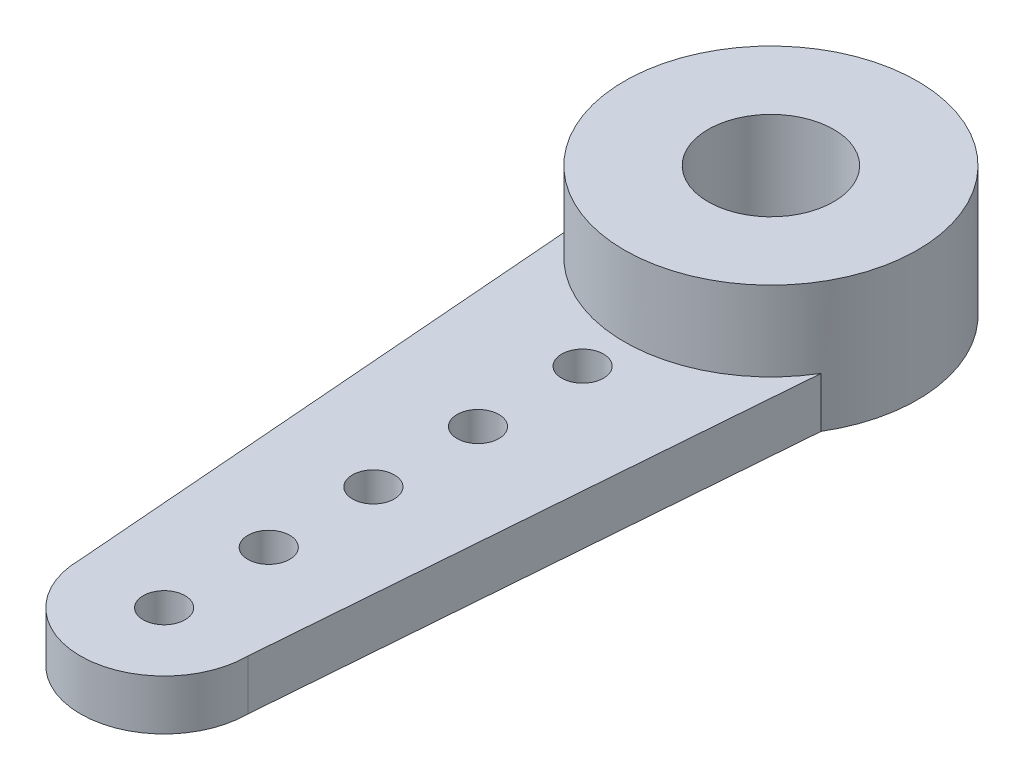
ISO-10303-21;
HEADER;
FILE_DESCRIPTION(('STEP AP214'),'2;1');
FILE_NAME('part.step','',(''),(''),'','','');
FILE_SCHEMA(('AUTOMOTIVE_DESIGN { 1 0 10303 214 1 1 1 1 }'));
ENDSEC;
DATA;
#1=APPLICATION_CONTEXT('core data for automotive mechanical design processes');
#2=APPLICATION_PROTOCOL_DEFINITION('international standard','automotive_design',2000,#1);
#3=PRODUCT_CONTEXT('',#1,'mechanical');
#4=PRODUCT('Part','Part','',(#3));
#5=PRODUCT_RELATED_PRODUCT_CATEGORY('part','',(#4));
#6=PRODUCT_DEFINITION_FORMATION('','',#4);
#7=PRODUCT_DEFINITION_CONTEXT('part definition',#1,'design');
#8=PRODUCT_DEFINITION('design','',#6,#7);
#9=PRODUCT_DEFINITION_SHAPE('','',#8);
#10=(LENGTH_UNIT() NAMED_UNIT(*) SI_UNIT(.MILLI.,.METRE.));
#11=(NAMED_UNIT(*) PLANE_ANGLE_UNIT() SI_UNIT($,.RADIAN.));
#12=(NAMED_UNIT(*) SI_UNIT($,.STERADIAN.) SOLID_ANGLE_UNIT());
#13=UNCERTAINTY_MEASURE_WITH_UNIT(LENGTH_MEASURE(1.E-05),#10,'distance_accuracy_value','');
#14=(GEOMETRIC_REPRESENTATION_CONTEXT(3) GLOBAL_UNCERTAINTY_ASSIGNED_CONTEXT((#13)) GLOBAL_UNIT_ASSIGNED_CONTEXT((#10,
#11,#12)) REPRESENTATION_CONTEXT('',''));
#15=CARTESIAN_POINT('',(0.,0.,0.));
#16=DIRECTION('',(0.,0.,1.));
#17=DIRECTION('',(1.,0.,0.));
#18=AXIS2_PLACEMENT_3D('',#15,#16,#17);
#19=CARTESIAN_POINT('',(0.,3.1,0.));
#20=DIRECTION('',(0.,-1.,0.));
#21=DIRECTION('',(0.,0.,-1.));
#22=AXIS2_PLACEMENT_3D('',#19,#20,#21);
#23=CYLINDRICAL_SURFACE('',#22,3.5);
#24=CARTESIAN_POINT('',(0.,3.1,0.));
#25=DIRECTION('',(0.,1.,0.));
#26=DIRECTION('',(0.,0.,1.));
#27=AXIS2_PLACEMENT_3D('',#24,#25,#26);
#28=CIRCLE('',#27,3.5);
#29=CARTESIAN_POINT('',(0.,3.1,3.5));
#30=VERTEX_POINT('',#29);
#31=EDGE_CURVE('E11',#30,#30,#28,.T.);
#32=ORIENTED_EDGE('',*,*,#31,.F.);
#33=EDGE_LOOP('',(#32));
#34=FACE_BOUND('',#33,.T.);
#35=DIRECTION('',(0.,-1.,0.));
#36=VECTOR('',#35,1.);
#37=CARTESIAN_POINT('',(-3.,1.2,1.80277563773199));
#38=LINE('',#37,#36);
#39=CARTESIAN_POINT('',(-3.,1.2,1.80277563773199));
#40=VERTEX_POINT('',#39);
#41=CARTESIAN_POINT('',(-3.,0.,1.80277563773199));
#42=VERTEX_POINT('',#41);
#43=EDGE_CURVE('E52',#40,#42,#38,.T.);
#44=ORIENTED_EDGE('',*,*,#43,.F.);
#45=CARTESIAN_POINT('',(0.,1.2,0.));
#46=DIRECTION('',(0.,-1.,0.));
#47=DIRECTION('',(0.,0.,1.));
#48=AXIS2_PLACEMENT_3D('',#45,#46,#47);
#49=CIRCLE('',#48,3.5);
#50=CARTESIAN_POINT('',(3.,1.2,1.80277563773199));
#51=VERTEX_POINT('',#50);
#52=EDGE_CURVE('E47',#51,#40,#49,.T.);
#53=ORIENTED_EDGE('',*,*,#52,.F.);
#54=DIRECTION('',(0.,-1.,0.));
#55=VECTOR('',#54,1.);
#56=CARTESIAN_POINT('',(3.,1.2,1.80277563773199));
#57=LINE('',#56,#55);
#58=CARTESIAN_POINT('',(3.,0.,1.80277563773199));
#59=VERTEX_POINT('',#58);
#60=EDGE_CURVE('E93',#51,#59,#57,.T.);
#61=ORIENTED_EDGE('',*,*,#60,.T.);
#62=CARTESIAN_POINT('',(0.,0.,0.));
#63=DIRECTION('',(0.,1.,0.));
#64=DIRECTION('',(0.,0.,1.));
#65=AXIS2_PLACEMENT_3D('',#62,#63,#64);
#66=CIRCLE('',#65,3.5);
#67=EDGE_CURVE('E36',#59,#42,#66,.T.);
#68=ORIENTED_EDGE('',*,*,#67,.T.);
#69=EDGE_LOOP('',(#44,#53,#61,#68));
#70=FACE_BOUND('',#69,.T.);
#71=ADVANCED_FACE('F33',(#34,#70),#23,.T.);
#72=CARTESIAN_POINT('',(0.,3.1,0.));
#73=DIRECTION('',(0.,1.,0.));
#74=DIRECTION('',(0.,0.,1.));
#75=AXIS2_PLACEMENT_3D('',#72,#73,#74);
#76=PLANE('',#75);
#77=CARTESIAN_POINT('',(0.,3.1,0.));
#78=DIRECTION('',(0.,1.,0.));
#79=DIRECTION('',(0.,0.,1.));
#80=AXIS2_PLACEMENT_3D('',#77,#78,#79);
#81=CIRCLE('',#80,1.5);
#82=CARTESIAN_POINT('',(0.,3.1,1.5));
#83=VERTEX_POINT('',#82);
#84=EDGE_CURVE('E274',#83,#83,#81,.T.);
#85=ORIENTED_EDGE('',*,*,#84,.F.);
#86=EDGE_LOOP('',(#85));
#87=FACE_BOUND('',#86,.T.);
#88=ORIENTED_EDGE('',*,*,#31,.T.);
#89=EDGE_LOOP('',(#88));
#90=FACE_BOUND('',#89,.T.);
#91=ADVANCED_FACE('F123',(#87,#90),#76,.T.);
#92=CARTESIAN_POINT('',(0.,0.,0.));
#93=DIRECTION('',(0.,1.,0.));
#94=DIRECTION('',(0.,0.,1.));
#95=AXIS2_PLACEMENT_3D('',#92,#93,#94);
#96=PLANE('',#95);
#97=CARTESIAN_POINT('',(0.,0.,12.));
#98=DIRECTION('',(0.,1.,0.));
#99=DIRECTION('',(0.,0.,1.));
#100=AXIS2_PLACEMENT_3D('',#97,#98,#99);
#101=CIRCLE('',#100,0.5);
#102=CARTESIAN_POINT('',(0.,0.,12.5));
#103=VERTEX_POINT('',#102);
#104=EDGE_CURVE('E246',#103,#103,#101,.F.);
#105=ORIENTED_EDGE('',*,*,#104,.F.);
#106=EDGE_LOOP('',(#105));
#107=FACE_BOUND('',#106,.T.);
#108=CARTESIAN_POINT('',(0.,0.,9.5));
#109=DIRECTION('',(0.,1.,0.));
#110=DIRECTION('',(0.,0.,1.));
#111=AXIS2_PLACEMENT_3D('',#108,#109,#110);
#112=CIRCLE('',#111,0.5);
#113=CARTESIAN_POINT('',(0.,0.,10.));
#114=VERTEX_POINT('',#113);
#115=EDGE_CURVE('E252',#114,#114,#112,.F.);
#116=ORIENTED_EDGE('',*,*,#115,.F.);
#117=EDGE_LOOP('',(#116));
#118=FACE_BOUND('',#117,.T.);
#119=CARTESIAN_POINT('',(0.,0.,7.));
#120=DIRECTION('',(0.,1.,0.));
#121=DIRECTION('',(0.,0.,1.));
#122=AXIS2_PLACEMENT_3D('',#119,#120,#121);
#123=CIRCLE('',#122,0.5);
#124=CARTESIAN_POINT('',(0.,0.,7.5));
#125=VERTEX_POINT('',#124);
#126=EDGE_CURVE('E258',#125,#125,#123,.F.);
#127=ORIENTED_EDGE('',*,*,#126,.F.);
#128=EDGE_LOOP('',(#127));
#129=FACE_BOUND('',#128,.T.);
#130=CARTESIAN_POINT('',(0.,0.,4.5));
#131=DIRECTION('',(0.,1.,0.));
#132=DIRECTION('',(0.,0.,1.));
#133=AXIS2_PLACEMENT_3D('',#130,#131,#132);
#134=CIRCLE('',#133,0.5);
#135=CARTESIAN_POINT('',(0.,0.,5.));
#136=VERTEX_POINT('',#135);
#137=EDGE_CURVE('E264',#136,#136,#134,.F.);
#138=ORIENTED_EDGE('',*,*,#137,.F.);
#139=EDGE_LOOP('',(#138));
#140=FACE_BOUND('',#139,.T.);
#141=CARTESIAN_POINT('',(0.,0.,14.5));
#142=DIRECTION('',(0.,1.,0.));
#143=DIRECTION('',(0.,0.,1.));
#144=AXIS2_PLACEMENT_3D('',#141,#142,#143);
#145=CIRCLE('',#144,0.5);
#146=CARTESIAN_POINT('',(0.,0.,15.));
#147=VERTEX_POINT('',#146);
#148=EDGE_CURVE('E250',#147,#147,#145,.F.);
#149=ORIENTED_EDGE('',*,*,#148,.F.);
#150=EDGE_LOOP('',(#149));
#151=FACE_BOUND('',#150,.T.);
#152=ORIENTED_EDGE('',*,*,#67,.F.);
#153=DIRECTION('',(0.0785142455836985,0.,-0.99691299181043));
#154=VECTOR('',#153,1.);
#155=CARTESIAN_POINT('',(3.,0.,1.80277563773199));
#156=LINE('',#155,#154);
#157=CARTESIAN_POINT('',(2.,0.,14.5));
#158=VERTEX_POINT('',#157);
#159=EDGE_CURVE('E101',#158,#59,#156,.T.);
#160=ORIENTED_EDGE('',*,*,#159,.F.);
#161=CARTESIAN_POINT('',(0.,0.,14.5));
#162=DIRECTION('',(0.,1.,0.));
#163=DIRECTION('',(0.,0.,-1.));
#164=AXIS2_PLACEMENT_3D('',#161,#162,#163);
#165=CIRCLE('',#164,2.);
#166=CARTESIAN_POINT('',(-2.,0.,14.5));
#167=VERTEX_POINT('',#166);
#168=EDGE_CURVE('E98',#167,#158,#165,.T.);
#169=ORIENTED_EDGE('',*,*,#168,.F.);
#170=DIRECTION('',(0.0785142455836985,0.,0.99691299181043));
#171=VECTOR('',#170,1.);
#172=CARTESIAN_POINT('',(-3.,0.,1.80277563773199));
#173=LINE('',#172,#171);
#174=EDGE_CURVE('E83',#42,#167,#173,.T.);
#175=ORIENTED_EDGE('',*,*,#174,.F.);
#176=EDGE_LOOP('',(#152,#160,#169,#175));
#177=FACE_BOUND('',#176,.T.);
#178=ADVANCED_FACE('F109',(#107,#118,#129,#140,#151,#177),#96,.F.);
#179=CARTESIAN_POINT('',(-3.,1.2,1.80277563773199));
#180=DIRECTION('',(0.99691299181043,0.,-0.0785142455836985));
#181=DIRECTION('',(-0.0785142455836985,0.,-0.99691299181043));
#182=AXIS2_PLACEMENT_3D('',#179,#180,#181);
#183=PLANE('',#182);
#184=ORIENTED_EDGE('',*,*,#174,.T.);
#185=DIRECTION('',(0.,-1.,0.));
#186=VECTOR('',#185,1.);
#187=CARTESIAN_POINT('',(-2.,1.2,14.5));
#188=LINE('',#187,#186);
#189=CARTESIAN_POINT('',(-2.,1.2,14.5));
#190=VERTEX_POINT('',#189);
#191=EDGE_CURVE('E80',#190,#167,#188,.T.);
#192=ORIENTED_EDGE('',*,*,#191,.F.);
#193=DIRECTION('',(0.0785142455836985,0.,0.99691299181043));
#194=VECTOR('',#193,1.);
#195=CARTESIAN_POINT('',(-3.,1.2,1.80277563773199));
#196=LINE('',#195,#194);
#197=EDGE_CURVE('E71',#40,#190,#196,.T.);
#198=ORIENTED_EDGE('',*,*,#197,.F.);
#199=ORIENTED_EDGE('',*,*,#43,.T.);
#200=EDGE_LOOP('',(#184,#192,#198,#199));
#201=FACE_BOUND('',#200,.T.);
#202=ADVANCED_FACE('F81',(#201),#183,.F.);
#203=CARTESIAN_POINT('',(0.,1.2,14.5));
#204=DIRECTION('',(0.,-1.,0.));
#205=DIRECTION('',(0.,0.,-1.));
#206=AXIS2_PLACEMENT_3D('',#203,#204,#205);
#207=CYLINDRICAL_SURFACE('',#206,2.);
#208=ORIENTED_EDGE('',*,*,#168,.T.);
#209=DIRECTION('',(0.,-1.,0.));
#210=VECTOR('',#209,1.);
#211=CARTESIAN_POINT('',(2.,1.2,14.5));
#212=LINE('',#211,#210);
#213=CARTESIAN_POINT('',(2.,1.2,14.5));
#214=VERTEX_POINT('',#213);
#215=EDGE_CURVE('E86',#214,#158,#212,.T.);
#216=ORIENTED_EDGE('',*,*,#215,.F.);
#217=CARTESIAN_POINT('',(0.,1.2,14.5));
#218=DIRECTION('',(0.,1.,0.));
#219=DIRECTION('',(0.,0.,-1.));
#220=AXIS2_PLACEMENT_3D('',#217,#218,#219);
#221=CIRCLE('',#220,2.);
#222=EDGE_CURVE('E75',#190,#214,#221,.T.);
#223=ORIENTED_EDGE('',*,*,#222,.F.);
#224=ORIENTED_EDGE('',*,*,#191,.T.);
#225=EDGE_LOOP('',(#208,#216,#223,#224));
#226=FACE_BOUND('',#225,.T.);
#227=ADVANCED_FACE('F88',(#226),#207,.T.);
#228=CARTESIAN_POINT('',(3.,1.2,1.80277563773199));
#229=DIRECTION('',(-0.99691299181043,0.,-0.0785142455836985));
#230=DIRECTION('',(-0.0785142455836985,0.,0.99691299181043));
#231=AXIS2_PLACEMENT_3D('',#228,#229,#230);
#232=PLANE('',#231);
#233=ORIENTED_EDGE('',*,*,#159,.T.);
#234=ORIENTED_EDGE('',*,*,#60,.F.);
#235=DIRECTION('',(0.0785142455836985,0.,-0.99691299181043));
#236=VECTOR('',#235,1.);
#237=CARTESIAN_POINT('',(3.,1.2,1.80277563773199));
#238=LINE('',#237,#236);
#239=EDGE_CURVE('E91',#214,#51,#238,.T.);
#240=ORIENTED_EDGE('',*,*,#239,.F.);
#241=ORIENTED_EDGE('',*,*,#215,.T.);
#242=EDGE_LOOP('',(#233,#234,#240,#241));
#243=FACE_BOUND('',#242,.T.);
#244=ADVANCED_FACE('F111',(#243),#232,.F.);
#245=CARTESIAN_POINT('',(0.,1.2,0.));
#246=DIRECTION('',(0.,1.,0.));
#247=DIRECTION('',(0.,0.,1.));
#248=AXIS2_PLACEMENT_3D('',#245,#246,#247);
#249=PLANE('',#248);
#250=CARTESIAN_POINT('',(0.,1.2,12.));
#251=DIRECTION('',(0.,1.,0.));
#252=DIRECTION('',(0.,0.,1.));
#253=AXIS2_PLACEMENT_3D('',#250,#251,#252);
#254=CIRCLE('',#253,0.5);
#255=CARTESIAN_POINT('',(0.,1.2,12.5));
#256=VERTEX_POINT('',#255);
#257=EDGE_CURVE('E243',#256,#256,#254,.T.);
#258=ORIENTED_EDGE('',*,*,#257,.F.);
#259=EDGE_LOOP('',(#258));
#260=FACE_BOUND('',#259,.T.);
#261=CARTESIAN_POINT('',(0.,1.2,9.5));
#262=DIRECTION('',(0.,1.,0.));
#263=DIRECTION('',(0.,0.,1.));
#264=AXIS2_PLACEMENT_3D('',#261,#262,#263);
#265=CIRCLE('',#264,0.5);
#266=CARTESIAN_POINT('',(0.,1.2,10.));
#267=VERTEX_POINT('',#266);
#268=EDGE_CURVE('E255',#267,#267,#265,.T.);
#269=ORIENTED_EDGE('',*,*,#268,.F.);
#270=EDGE_LOOP('',(#269));
#271=FACE_BOUND('',#270,.T.);
#272=CARTESIAN_POINT('',(0.,1.2,7.));
#273=DIRECTION('',(0.,1.,0.));
#274=DIRECTION('',(0.,0.,1.));
#275=AXIS2_PLACEMENT_3D('',#272,#273,#274);
#276=CIRCLE('',#275,0.5);
#277=CARTESIAN_POINT('',(0.,1.2,7.5));
#278=VERTEX_POINT('',#277);
#279=EDGE_CURVE('E261',#278,#278,#276,.T.);
#280=ORIENTED_EDGE('',*,*,#279,.F.);
#281=EDGE_LOOP('',(#280));
#282=FACE_BOUND('',#281,.T.);
#283=CARTESIAN_POINT('',(0.,1.2,4.5));
#284=DIRECTION('',(0.,1.,0.));
#285=DIRECTION('',(0.,0.,1.));
#286=AXIS2_PLACEMENT_3D('',#283,#284,#285);
#287=CIRCLE('',#286,0.5);
#288=CARTESIAN_POINT('',(0.,1.2,5.));
#289=VERTEX_POINT('',#288);
#290=EDGE_CURVE('E267',#289,#289,#287,.T.);
#291=ORIENTED_EDGE('',*,*,#290,.F.);
#292=EDGE_LOOP('',(#291));
#293=FACE_BOUND('',#292,.T.);
#294=CARTESIAN_POINT('',(0.,1.2,14.5));
#295=DIRECTION('',(0.,1.,0.));
#296=DIRECTION('',(0.,0.,1.));
#297=AXIS2_PLACEMENT_3D('',#294,#295,#296);
#298=CIRCLE('',#297,0.5);
#299=CARTESIAN_POINT('',(0.,1.2,15.));
#300=VERTEX_POINT('',#299);
#301=EDGE_CURVE('E247',#300,#300,#298,.T.);
#302=ORIENTED_EDGE('',*,*,#301,.F.);
#303=EDGE_LOOP('',(#302));
#304=FACE_BOUND('',#303,.T.);
#305=ORIENTED_EDGE('',*,*,#52,.T.);
#306=ORIENTED_EDGE('',*,*,#197,.T.);
#307=ORIENTED_EDGE('',*,*,#222,.T.);
#308=ORIENTED_EDGE('',*,*,#239,.T.);
#309=EDGE_LOOP('',(#305,#306,#307,#308));
#310=FACE_BOUND('',#309,.T.);
#311=ADVANCED_FACE('F73',(#260,#271,#282,#293,#304,#310),#249,.T.);
#312=CARTESIAN_POINT('',(0.,0.0999999999999998,0.));
#313=DIRECTION('',(0.,1.,0.));
#314=DIRECTION('',(0.,0.,1.));
#315=AXIS2_PLACEMENT_3D('',#312,#313,#314);
#316=CYLINDRICAL_SURFACE('',#315,1.5);
#317=CARTESIAN_POINT('',(0.,0.0999999999999998,0.));
#318=DIRECTION('',(0.,1.,0.));
#319=DIRECTION('',(0.,0.,1.));
#320=AXIS2_PLACEMENT_3D('',#317,#318,#319);
#321=CIRCLE('',#320,1.5);
#322=CARTESIAN_POINT('',(0.,0.0999999999999998,1.5));
#323=VERTEX_POINT('',#322);
#324=EDGE_CURVE('E99',#323,#323,#321,.T.);
#325=ORIENTED_EDGE('',*,*,#324,.F.);
#326=EDGE_LOOP('',(#325));
#327=FACE_BOUND('',#326,.T.);
#328=ORIENTED_EDGE('',*,*,#84,.T.);
#329=EDGE_LOOP('',(#328));
#330=FACE_BOUND('',#329,.T.);
#331=ADVANCED_FACE('F118',(#327,#330),#316,.F.);
#332=CARTESIAN_POINT('',(0.,0.0999999999999998,0.));
#333=DIRECTION('',(0.,1.,0.));
#334=DIRECTION('',(0.,0.,1.));
#335=AXIS2_PLACEMENT_3D('',#332,#333,#334);
#336=PLANE('',#335);
#337=ORIENTED_EDGE('',*,*,#324,.T.);
#338=EDGE_LOOP('',(#337));
#339=FACE_BOUND('',#338,.T.);
#340=ADVANCED_FACE('F166',(#339),#336,.T.);
#341=CARTESIAN_POINT('',(0.,-0.000999999999999916,14.5));
#342=DIRECTION('',(0.,1.,0.));
#343=DIRECTION('',(0.,0.,1.));
#344=AXIS2_PLACEMENT_3D('',#341,#342,#343);
#345=CYLINDRICAL_SURFACE('',#344,0.5);
#346=ORIENTED_EDGE('',*,*,#301,.T.);
#347=EDGE_LOOP('',(#346));
#348=FACE_BOUND('',#347,.T.);
#349=ORIENTED_EDGE('',*,*,#148,.T.);
#350=EDGE_LOOP('',(#349));
#351=FACE_BOUND('',#350,.T.);
#352=ADVANCED_FACE('F175',(#348,#351),#345,.F.);
#353=CARTESIAN_POINT('',(0.,-0.000999999999999916,4.5));
#354=DIRECTION('',(0.,1.,0.));
#355=DIRECTION('',(0.,0.,1.));
#356=AXIS2_PLACEMENT_3D('',#353,#354,#355);
#357=CYLINDRICAL_SURFACE('',#356,0.5);
#358=ORIENTED_EDGE('',*,*,#290,.T.);
#359=EDGE_LOOP('',(#358));
#360=FACE_BOUND('',#359,.T.);
#361=ORIENTED_EDGE('',*,*,#137,.T.);
#362=EDGE_LOOP('',(#361));
#363=FACE_BOUND('',#362,.T.);
#364=ADVANCED_FACE('F196',(#360,#363),#357,.F.);
#365=CARTESIAN_POINT('',(0.,-0.000999999999999916,7.));
#366=DIRECTION('',(0.,1.,0.));
#367=DIRECTION('',(0.,0.,1.));
#368=AXIS2_PLACEMENT_3D('',#365,#366,#367);
#369=CYLINDRICAL_SURFACE('',#368,0.5);
#370=ORIENTED_EDGE('',*,*,#279,.T.);
#371=EDGE_LOOP('',(#370));
#372=FACE_BOUND('',#371,.T.);
#373=ORIENTED_EDGE('',*,*,#126,.T.);
#374=EDGE_LOOP('',(#373));
#375=FACE_BOUND('',#374,.T.);
#376=ADVANCED_FACE('F206',(#372,#375),#369,.F.);
#377=CARTESIAN_POINT('',(0.,-0.000999999999999916,9.5));
#378=DIRECTION('',(0.,1.,0.));
#379=DIRECTION('',(0.,0.,1.));
#380=AXIS2_PLACEMENT_3D('',#377,#378,#379);
#381=CYLINDRICAL_SURFACE('',#380,0.5);
#382=ORIENTED_EDGE('',*,*,#268,.T.);
#383=EDGE_LOOP('',(#382));
#384=FACE_BOUND('',#383,.T.);
#385=ORIENTED_EDGE('',*,*,#115,.T.);
#386=EDGE_LOOP('',(#385));
#387=FACE_BOUND('',#386,.T.);
#388=ADVANCED_FACE('F216',(#384,#387),#381,.F.);
#389=CARTESIAN_POINT('',(0.,-0.000999999999999916,12.));
#390=DIRECTION('',(0.,1.,0.));
#391=DIRECTION('',(0.,0.,1.));
#392=AXIS2_PLACEMENT_3D('',#389,#390,#391);
#393=CYLINDRICAL_SURFACE('',#392,0.5);
#394=ORIENTED_EDGE('',*,*,#257,.T.);
#395=EDGE_LOOP('',(#394));
#396=FACE_BOUND('',#395,.T.);
#397=ORIENTED_EDGE('',*,*,#104,.T.);
#398=EDGE_LOOP('',(#397));
#399=FACE_BOUND('',#398,.T.);
#400=ADVANCED_FACE('F226',(#396,#399),#393,.F.);
#401=CLOSED_SHELL('',(#71,#91,#178,#202,#227,#244,#311,#331,#340,#352,#364,#376,#388,#400));
#402=MANIFOLD_SOLID_BREP('B2',#401);
#403=ADVANCED_BREP_SHAPE_REPRESENTATION('',(#18,#402),#14);
#404=SHAPE_DEFINITION_REPRESENTATION(#9,#403);
ENDSEC;
END-ISO-10303-21;
